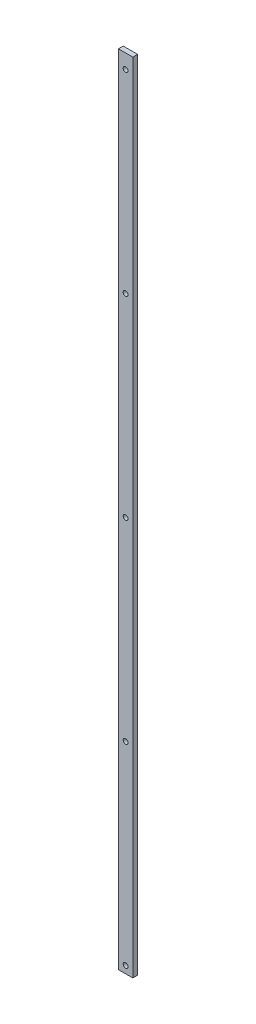
ISO-10303-21;
HEADER;
FILE_DESCRIPTION(('STEP AP214'),'2;1');
FILE_NAME('part.step','',(''),(''),'','','');
FILE_SCHEMA(('AUTOMOTIVE_DESIGN { 1 0 10303 214 1 1 1 1 }'));
ENDSEC;
DATA;
#1=APPLICATION_CONTEXT('core data for automotive mechanical design processes');
#2=APPLICATION_PROTOCOL_DEFINITION('international standard','automotive_design',2000,#1);
#3=PRODUCT_CONTEXT('',#1,'mechanical');
#4=PRODUCT('Part','Part','',(#3));
#5=PRODUCT_RELATED_PRODUCT_CATEGORY('part','',(#4));
#6=PRODUCT_DEFINITION_FORMATION('','',#4);
#7=PRODUCT_DEFINITION_CONTEXT('part definition',#1,'design');
#8=PRODUCT_DEFINITION('design','',#6,#7);
#9=PRODUCT_DEFINITION_SHAPE('','',#8);
#10=(LENGTH_UNIT() NAMED_UNIT(*) SI_UNIT(.MILLI.,.METRE.));
#11=(NAMED_UNIT(*) PLANE_ANGLE_UNIT() SI_UNIT($,.RADIAN.));
#12=(NAMED_UNIT(*) SI_UNIT($,.STERADIAN.) SOLID_ANGLE_UNIT());
#13=UNCERTAINTY_MEASURE_WITH_UNIT(LENGTH_MEASURE(1.E-05),#10,'distance_accuracy_value','');
#14=(GEOMETRIC_REPRESENTATION_CONTEXT(3) GLOBAL_UNCERTAINTY_ASSIGNED_CONTEXT((#13)) GLOBAL_UNIT_ASSIGNED_CONTEXT((#10,
#11,#12)) REPRESENTATION_CONTEXT('',''));
#15=CARTESIAN_POINT('',(0.,0.,0.));
#16=DIRECTION('',(0.,0.,1.));
#17=DIRECTION('',(1.,0.,0.));
#18=AXIS2_PLACEMENT_3D('',#15,#16,#17);
#19=CARTESIAN_POINT('',(0.,0.,6.35));
#20=DIRECTION('',(0.,0.,-1.));
#21=DIRECTION('',(-1.,0.,0.));
#22=AXIS2_PLACEMENT_3D('',#19,#20,#21);
#23=PLANE('',#22);
#24=DIRECTION('',(0.,-1.,0.));
#25=VECTOR('',#24,1.);
#26=CARTESIAN_POINT('',(0.,0.,6.35));
#27=LINE('',#26,#25);
#28=CARTESIAN_POINT('',(0.,1054.735,6.35));
#29=VERTEX_POINT('',#28);
#30=CARTESIAN_POINT('',(0.,0.,6.35));
#31=VERTEX_POINT('',#30);
#32=EDGE_CURVE('E85',#29,#31,#27,.T.);
#33=ORIENTED_EDGE('',*,*,#32,.T.);
#34=DIRECTION('',(1.,0.,0.));
#35=VECTOR('',#34,1.);
#36=CARTESIAN_POINT('',(0.,0.,6.35));
#37=LINE('',#36,#35);
#38=CARTESIAN_POINT('',(19.05,0.,6.35));
#39=VERTEX_POINT('',#38);
#40=EDGE_CURVE('E80',#31,#39,#37,.T.);
#41=ORIENTED_EDGE('',*,*,#40,.T.);
#42=DIRECTION('',(0.,1.,0.));
#43=VECTOR('',#42,1.);
#44=CARTESIAN_POINT('',(19.05,0.,6.35));
#45=LINE('',#44,#43);
#46=CARTESIAN_POINT('',(19.05,1054.735,6.35));
#47=VERTEX_POINT('',#46);
#48=EDGE_CURVE('E83',#39,#47,#45,.T.);
#49=ORIENTED_EDGE('',*,*,#48,.T.);
#50=DIRECTION('',(-1.,0.,0.));
#51=VECTOR('',#50,1.);
#52=CARTESIAN_POINT('',(0.,1054.735,6.35));
#53=LINE('',#52,#51);
#54=EDGE_CURVE('E50',#47,#29,#53,.T.);
#55=ORIENTED_EDGE('',*,*,#54,.T.);
#56=EDGE_LOOP('',(#33,#41,#49,#55));
#57=FACE_BOUND('',#56,.T.);
#58=CARTESIAN_POINT('',(9.525,9.525,6.35));
#59=DIRECTION('',(0.,0.,1.));
#60=DIRECTION('',(1.,0.,0.));
#61=AXIS2_PLACEMENT_3D('',#58,#59,#60);
#62=CIRCLE('',#61,3.175);
#63=CARTESIAN_POINT('',(12.7,9.525,6.35));
#64=VERTEX_POINT('',#63);
#65=EDGE_CURVE('E100',#64,#64,#62,.T.);
#66=ORIENTED_EDGE('',*,*,#65,.F.);
#67=EDGE_LOOP('',(#66));
#68=FACE_BOUND('',#67,.T.);
#69=CARTESIAN_POINT('',(9.52499999999911,266.065,6.35));
#70=DIRECTION('',(0.,0.,1.));
#71=DIRECTION('',(1.,0.,0.));
#72=AXIS2_PLACEMENT_3D('',#69,#70,#71);
#73=CIRCLE('',#72,3.175);
#74=CARTESIAN_POINT('',(12.6999999999991,266.065,6.35));
#75=VERTEX_POINT('',#74);
#76=EDGE_CURVE('E115',#75,#75,#73,.T.);
#77=ORIENTED_EDGE('',*,*,#76,.F.);
#78=EDGE_LOOP('',(#77));
#79=FACE_BOUND('',#78,.T.);
#80=CARTESIAN_POINT('',(9.52499999999821,522.605,6.35));
#81=DIRECTION('',(0.,0.,1.));
#82=DIRECTION('',(1.,0.,0.));
#83=AXIS2_PLACEMENT_3D('',#80,#81,#82);
#84=CIRCLE('',#83,3.175);
#85=CARTESIAN_POINT('',(12.6999999999982,522.605,6.35));
#86=VERTEX_POINT('',#85);
#87=EDGE_CURVE('E121',#86,#86,#84,.T.);
#88=ORIENTED_EDGE('',*,*,#87,.F.);
#89=EDGE_LOOP('',(#88));
#90=FACE_BOUND('',#89,.T.);
#91=CARTESIAN_POINT('',(9.52499999999731,779.145,6.35));
#92=DIRECTION('',(0.,0.,1.));
#93=DIRECTION('',(1.,0.,0.));
#94=AXIS2_PLACEMENT_3D('',#91,#92,#93);
#95=CIRCLE('',#94,3.175);
#96=CARTESIAN_POINT('',(12.6999999999973,779.145,6.35));
#97=VERTEX_POINT('',#96);
#98=EDGE_CURVE('E127',#97,#97,#95,.T.);
#99=ORIENTED_EDGE('',*,*,#98,.F.);
#100=EDGE_LOOP('',(#99));
#101=FACE_BOUND('',#100,.T.);
#102=CARTESIAN_POINT('',(9.52499999999642,1035.685,6.35));
#103=DIRECTION('',(0.,0.,1.));
#104=DIRECTION('',(1.,0.,0.));
#105=AXIS2_PLACEMENT_3D('',#102,#103,#104);
#106=CIRCLE('',#105,3.17499999999997);
#107=CARTESIAN_POINT('',(12.6999999999964,1035.685,6.35));
#108=VERTEX_POINT('',#107);
#109=EDGE_CURVE('E133',#108,#108,#106,.T.);
#110=ORIENTED_EDGE('',*,*,#109,.F.);
#111=EDGE_LOOP('',(#110));
#112=FACE_BOUND('',#111,.T.);
#113=ADVANCED_FACE('F33',(#57,#68,#79,#90,#101,#112),#23,.F.);
#114=CARTESIAN_POINT('',(0.,0.,0.));
#115=DIRECTION('',(0.,0.,-1.));
#116=DIRECTION('',(-1.,0.,0.));
#117=AXIS2_PLACEMENT_3D('',#114,#115,#116);
#118=PLANE('',#117);
#119=CARTESIAN_POINT('',(9.52499999999731,779.145,0.));
#120=DIRECTION('',(0.,0.,1.));
#121=DIRECTION('',(1.,0.,0.));
#122=AXIS2_PLACEMENT_3D('',#119,#120,#121);
#123=CIRCLE('',#122,3.175);
#124=CARTESIAN_POINT('',(12.6999999999973,779.145,0.));
#125=VERTEX_POINT('',#124);
#126=EDGE_CURVE('E130',#125,#125,#123,.T.);
#127=ORIENTED_EDGE('',*,*,#126,.T.);
#128=EDGE_LOOP('',(#127));
#129=FACE_BOUND('',#128,.T.);
#130=CARTESIAN_POINT('',(9.52499999999911,266.065,0.));
#131=DIRECTION('',(0.,0.,1.));
#132=DIRECTION('',(1.,0.,0.));
#133=AXIS2_PLACEMENT_3D('',#130,#131,#132);
#134=CIRCLE('',#133,3.175);
#135=CARTESIAN_POINT('',(12.6999999999991,266.065,0.));
#136=VERTEX_POINT('',#135);
#137=EDGE_CURVE('E118',#136,#136,#134,.T.);
#138=ORIENTED_EDGE('',*,*,#137,.T.);
#139=EDGE_LOOP('',(#138));
#140=FACE_BOUND('',#139,.T.);
#141=DIRECTION('',(0.,-1.,0.));
#142=VECTOR('',#141,1.);
#143=CARTESIAN_POINT('',(0.,0.,0.));
#144=LINE('',#143,#142);
#145=CARTESIAN_POINT('',(0.,1054.735,0.));
#146=VERTEX_POINT('',#145);
#147=CARTESIAN_POINT('',(0.,0.,0.));
#148=VERTEX_POINT('',#147);
#149=EDGE_CURVE('E97',#146,#148,#144,.T.);
#150=ORIENTED_EDGE('',*,*,#149,.F.);
#151=DIRECTION('',(-1.,0.,0.));
#152=VECTOR('',#151,1.);
#153=CARTESIAN_POINT('',(0.,1054.735,0.));
#154=LINE('',#153,#152);
#155=CARTESIAN_POINT('',(19.05,1054.735,0.));
#156=VERTEX_POINT('',#155);
#157=EDGE_CURVE('E73',#156,#146,#154,.T.);
#158=ORIENTED_EDGE('',*,*,#157,.F.);
#159=DIRECTION('',(0.,1.,0.));
#160=VECTOR('',#159,1.);
#161=CARTESIAN_POINT('',(19.05,0.,0.));
#162=LINE('',#161,#160);
#163=CARTESIAN_POINT('',(19.05,0.,0.));
#164=VERTEX_POINT('',#163);
#165=EDGE_CURVE('E67',#164,#156,#162,.T.);
#166=ORIENTED_EDGE('',*,*,#165,.F.);
#167=DIRECTION('',(1.,0.,0.));
#168=VECTOR('',#167,1.);
#169=CARTESIAN_POINT('',(0.,0.,0.));
#170=LINE('',#169,#168);
#171=EDGE_CURVE('E89',#148,#164,#170,.T.);
#172=ORIENTED_EDGE('',*,*,#171,.F.);
#173=EDGE_LOOP('',(#150,#158,#166,#172));
#174=FACE_BOUND('',#173,.T.);
#175=CARTESIAN_POINT('',(9.525,9.525,0.));
#176=DIRECTION('',(0.,0.,1.));
#177=DIRECTION('',(1.,0.,0.));
#178=AXIS2_PLACEMENT_3D('',#175,#176,#177);
#179=CIRCLE('',#178,3.175);
#180=CARTESIAN_POINT('',(12.7,9.525,0.));
#181=VERTEX_POINT('',#180);
#182=EDGE_CURVE('E112',#181,#181,#179,.T.);
#183=ORIENTED_EDGE('',*,*,#182,.T.);
#184=EDGE_LOOP('',(#183));
#185=FACE_BOUND('',#184,.T.);
#186=CARTESIAN_POINT('',(9.52499999999821,522.605,0.));
#187=DIRECTION('',(0.,0.,1.));
#188=DIRECTION('',(1.,0.,0.));
#189=AXIS2_PLACEMENT_3D('',#186,#187,#188);
#190=CIRCLE('',#189,3.175);
#191=CARTESIAN_POINT('',(12.6999999999982,522.605,0.));
#192=VERTEX_POINT('',#191);
#193=EDGE_CURVE('E124',#192,#192,#190,.T.);
#194=ORIENTED_EDGE('',*,*,#193,.T.);
#195=EDGE_LOOP('',(#194));
#196=FACE_BOUND('',#195,.T.);
#197=CARTESIAN_POINT('',(9.52499999999642,1035.685,0.));
#198=DIRECTION('',(0.,0.,1.));
#199=DIRECTION('',(1.,0.,0.));
#200=AXIS2_PLACEMENT_3D('',#197,#198,#199);
#201=CIRCLE('',#200,3.17499999999997);
#202=CARTESIAN_POINT('',(12.6999999999964,1035.685,0.));
#203=VERTEX_POINT('',#202);
#204=EDGE_CURVE('E136',#203,#203,#201,.T.);
#205=ORIENTED_EDGE('',*,*,#204,.T.);
#206=EDGE_LOOP('',(#205));
#207=FACE_BOUND('',#206,.T.);
#208=ADVANCED_FACE('F108',(#129,#140,#174,#185,#196,#207),#118,.T.);
#209=CARTESIAN_POINT('',(0.,0.,6.35));
#210=DIRECTION('',(1.,0.,0.));
#211=DIRECTION('',(0.,0.,-1.));
#212=AXIS2_PLACEMENT_3D('',#209,#210,#211);
#213=PLANE('',#212);
#214=ORIENTED_EDGE('',*,*,#149,.T.);
#215=DIRECTION('',(0.,0.,-1.));
#216=VECTOR('',#215,1.);
#217=CARTESIAN_POINT('',(0.,0.,6.35));
#218=LINE('',#217,#216);
#219=EDGE_CURVE('E11',#31,#148,#218,.T.);
#220=ORIENTED_EDGE('',*,*,#219,.F.);
#221=ORIENTED_EDGE('',*,*,#32,.F.);
#222=DIRECTION('',(0.,0.,-1.));
#223=VECTOR('',#222,1.);
#224=CARTESIAN_POINT('',(0.,1054.735,6.35));
#225=LINE('',#224,#223);
#226=EDGE_CURVE('E93',#29,#146,#225,.T.);
#227=ORIENTED_EDGE('',*,*,#226,.T.);
#228=EDGE_LOOP('',(#214,#220,#221,#227));
#229=FACE_BOUND('',#228,.T.);
#230=ADVANCED_FACE('F35',(#229),#213,.F.);
#231=CARTESIAN_POINT('',(0.,0.,6.35));
#232=DIRECTION('',(0.,1.,0.));
#233=DIRECTION('',(0.,0.,1.));
#234=AXIS2_PLACEMENT_3D('',#231,#232,#233);
#235=PLANE('',#234);
#236=ORIENTED_EDGE('',*,*,#171,.T.);
#237=DIRECTION('',(0.,0.,-1.));
#238=VECTOR('',#237,1.);
#239=CARTESIAN_POINT('',(19.05,0.,6.35));
#240=LINE('',#239,#238);
#241=EDGE_CURVE('E42',#39,#164,#240,.T.);
#242=ORIENTED_EDGE('',*,*,#241,.F.);
#243=ORIENTED_EDGE('',*,*,#40,.F.);
#244=ORIENTED_EDGE('',*,*,#219,.T.);
#245=EDGE_LOOP('',(#236,#242,#243,#244));
#246=FACE_BOUND('',#245,.T.);
#247=ADVANCED_FACE('F88',(#246),#235,.F.);
#248=CARTESIAN_POINT('',(19.05,0.,6.35));
#249=DIRECTION('',(-1.,0.,0.));
#250=DIRECTION('',(0.,0.,1.));
#251=AXIS2_PLACEMENT_3D('',#248,#249,#250);
#252=PLANE('',#251);
#253=ORIENTED_EDGE('',*,*,#165,.T.);
#254=DIRECTION('',(0.,0.,-1.));
#255=VECTOR('',#254,1.);
#256=CARTESIAN_POINT('',(19.05,1054.735,6.35));
#257=LINE('',#256,#255);
#258=EDGE_CURVE('E90',#47,#156,#257,.T.);
#259=ORIENTED_EDGE('',*,*,#258,.F.);
#260=ORIENTED_EDGE('',*,*,#48,.F.);
#261=ORIENTED_EDGE('',*,*,#241,.T.);
#262=EDGE_LOOP('',(#253,#259,#260,#261));
#263=FACE_BOUND('',#262,.T.);
#264=ADVANCED_FACE('F91',(#263),#252,.F.);
#265=CARTESIAN_POINT('',(0.,1054.735,6.35));
#266=DIRECTION('',(0.,-1.,0.));
#267=DIRECTION('',(0.,0.,-1.));
#268=AXIS2_PLACEMENT_3D('',#265,#266,#267);
#269=PLANE('',#268);
#270=ORIENTED_EDGE('',*,*,#157,.T.);
#271=ORIENTED_EDGE('',*,*,#226,.F.);
#272=ORIENTED_EDGE('',*,*,#54,.F.);
#273=ORIENTED_EDGE('',*,*,#258,.T.);
#274=EDGE_LOOP('',(#270,#271,#272,#273));
#275=FACE_BOUND('',#274,.T.);
#276=ADVANCED_FACE('F105',(#275),#269,.F.);
#277=CARTESIAN_POINT('',(9.525,9.525,6.35));
#278=DIRECTION('',(0.,0.,-1.));
#279=DIRECTION('',(-1.,0.,0.));
#280=AXIS2_PLACEMENT_3D('',#277,#278,#279);
#281=CYLINDRICAL_SURFACE('',#280,3.175);
#282=ORIENTED_EDGE('',*,*,#65,.T.);
#283=EDGE_LOOP('',(#282));
#284=FACE_BOUND('',#283,.T.);
#285=ORIENTED_EDGE('',*,*,#182,.F.);
#286=EDGE_LOOP('',(#285));
#287=FACE_BOUND('',#286,.T.);
#288=ADVANCED_FACE('F153',(#284,#287),#281,.F.);
#289=CARTESIAN_POINT('',(9.52499999999911,266.065,6.35));
#290=DIRECTION('',(0.,0.,-1.));
#291=DIRECTION('',(-1.,0.,0.));
#292=AXIS2_PLACEMENT_3D('',#289,#290,#291);
#293=CYLINDRICAL_SURFACE('',#292,3.175);
#294=ORIENTED_EDGE('',*,*,#76,.T.);
#295=EDGE_LOOP('',(#294));
#296=FACE_BOUND('',#295,.T.);
#297=ORIENTED_EDGE('',*,*,#137,.F.);
#298=EDGE_LOOP('',(#297));
#299=FACE_BOUND('',#298,.T.);
#300=ADVANCED_FACE('F199',(#296,#299),#293,.F.);
#301=CARTESIAN_POINT('',(9.52499999999821,522.605,6.35));
#302=DIRECTION('',(0.,0.,-1.));
#303=DIRECTION('',(-1.,0.,0.));
#304=AXIS2_PLACEMENT_3D('',#301,#302,#303);
#305=CYLINDRICAL_SURFACE('',#304,3.175);
#306=ORIENTED_EDGE('',*,*,#87,.T.);
#307=EDGE_LOOP('',(#306));
#308=FACE_BOUND('',#307,.T.);
#309=ORIENTED_EDGE('',*,*,#193,.F.);
#310=EDGE_LOOP('',(#309));
#311=FACE_BOUND('',#310,.T.);
#312=ADVANCED_FACE('F207',(#308,#311),#305,.F.);
#313=CARTESIAN_POINT('',(9.52499999999731,779.145,6.35));
#314=DIRECTION('',(0.,0.,-1.));
#315=DIRECTION('',(-1.,0.,0.));
#316=AXIS2_PLACEMENT_3D('',#313,#314,#315);
#317=CYLINDRICAL_SURFACE('',#316,3.175);
#318=ORIENTED_EDGE('',*,*,#98,.T.);
#319=EDGE_LOOP('',(#318));
#320=FACE_BOUND('',#319,.T.);
#321=ORIENTED_EDGE('',*,*,#126,.F.);
#322=EDGE_LOOP('',(#321));
#323=FACE_BOUND('',#322,.T.);
#324=ADVANCED_FACE('F215',(#320,#323),#317,.F.);
#325=CARTESIAN_POINT('',(9.52499999999642,1035.685,6.35));
#326=DIRECTION('',(0.,0.,-1.));
#327=DIRECTION('',(-1.,0.,0.));
#328=AXIS2_PLACEMENT_3D('',#325,#326,#327);
#329=CYLINDRICAL_SURFACE('',#328,3.17499999999997);
#330=ORIENTED_EDGE('',*,*,#109,.T.);
#331=EDGE_LOOP('',(#330));
#332=FACE_BOUND('',#331,.T.);
#333=ORIENTED_EDGE('',*,*,#204,.F.);
#334=EDGE_LOOP('',(#333));
#335=FACE_BOUND('',#334,.T.);
#336=ADVANCED_FACE('F142',(#332,#335),#329,.F.);
#337=CLOSED_SHELL('',(#113,#208,#230,#247,#264,#276,#288,#300,#312,#324,#336));
#338=MANIFOLD_SOLID_BREP('B2',#337);
#339=ADVANCED_BREP_SHAPE_REPRESENTATION('',(#18,#338),#14);
#340=SHAPE_DEFINITION_REPRESENTATION(#9,#339);
ENDSEC;
END-ISO-10303-21;
